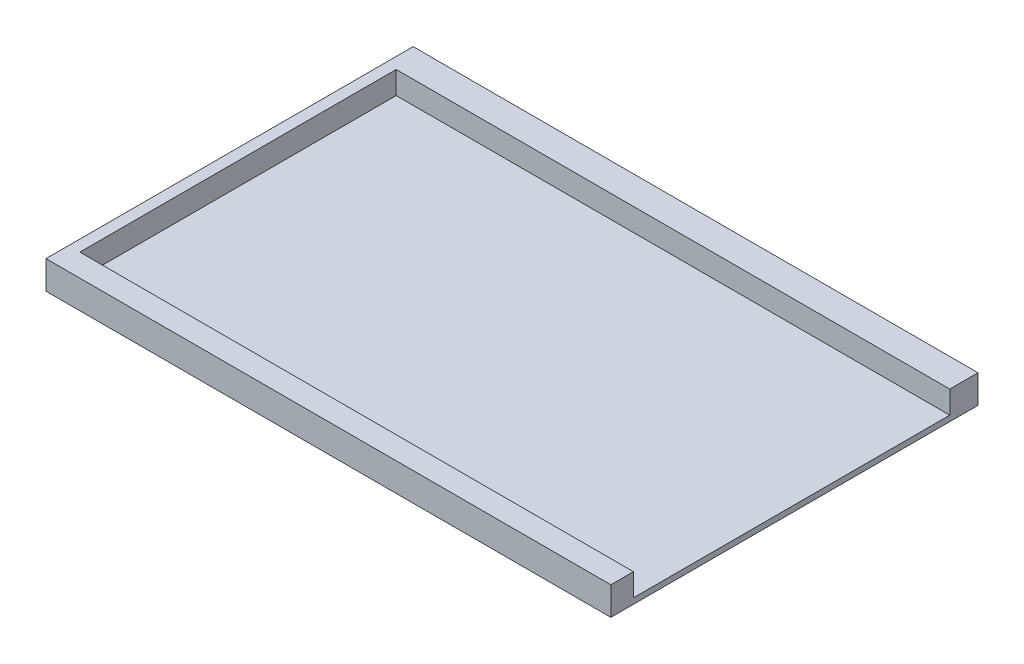
ISO-10303-21;
HEADER;
FILE_DESCRIPTION(('STEP AP214'),'2;1');
FILE_NAME('part.step','',(''),(''),'','','');
FILE_SCHEMA(('AUTOMOTIVE_DESIGN { 1 0 10303 214 1 1 1 1 }'));
ENDSEC;
DATA;
#1=APPLICATION_CONTEXT('core data for automotive mechanical design processes');
#2=APPLICATION_PROTOCOL_DEFINITION('international standard','automotive_design',2000,#1);
#3=PRODUCT_CONTEXT('',#1,'mechanical');
#4=PRODUCT('Part','Part','',(#3));
#5=PRODUCT_RELATED_PRODUCT_CATEGORY('part','',(#4));
#6=PRODUCT_DEFINITION_FORMATION('','',#4);
#7=PRODUCT_DEFINITION_CONTEXT('part definition',#1,'design');
#8=PRODUCT_DEFINITION('design','',#6,#7);
#9=PRODUCT_DEFINITION_SHAPE('','',#8);
#10=(LENGTH_UNIT() NAMED_UNIT(*) SI_UNIT(.MILLI.,.METRE.));
#11=(NAMED_UNIT(*) PLANE_ANGLE_UNIT() SI_UNIT($,.RADIAN.));
#12=(NAMED_UNIT(*) SI_UNIT($,.STERADIAN.) SOLID_ANGLE_UNIT());
#13=UNCERTAINTY_MEASURE_WITH_UNIT(LENGTH_MEASURE(1.E-05),#10,'distance_accuracy_value','');
#14=(GEOMETRIC_REPRESENTATION_CONTEXT(3) GLOBAL_UNCERTAINTY_ASSIGNED_CONTEXT((#13)) GLOBAL_UNIT_ASSIGNED_CONTEXT((#10,
#11,#12)) REPRESENTATION_CONTEXT('',''));
#15=CARTESIAN_POINT('',(0.,0.,0.));
#16=DIRECTION('',(0.,0.,1.));
#17=DIRECTION('',(1.,0.,0.));
#18=AXIS2_PLACEMENT_3D('',#15,#16,#17);
#19=CARTESIAN_POINT('',(50.,5.,32.5));
#20=DIRECTION('',(-1.,0.,0.));
#21=DIRECTION('',(0.,0.,1.));
#22=AXIS2_PLACEMENT_3D('',#19,#20,#21);
#23=PLANE('',#22);
#24=DIRECTION('',(0.,0.,-1.));
#25=VECTOR('',#24,1.);
#26=CARTESIAN_POINT('',(50.,1.,28.5));
#27=LINE('',#26,#25);
#28=CARTESIAN_POINT('',(50.,1.,28.5));
#29=VERTEX_POINT('',#28);
#30=CARTESIAN_POINT('',(50.,1.,-27.5));
#31=VERTEX_POINT('',#30);
#32=EDGE_CURVE('E140',#29,#31,#27,.T.);
#33=ORIENTED_EDGE('',*,*,#32,.F.);
#34=DIRECTION('',(0.,-1.,0.));
#35=VECTOR('',#34,1.);
#36=CARTESIAN_POINT('',(50.,1.,28.5));
#37=LINE('',#36,#35);
#38=CARTESIAN_POINT('',(50.,5.,28.5));
#39=VERTEX_POINT('',#38);
#40=EDGE_CURVE('E121',#39,#29,#37,.T.);
#41=ORIENTED_EDGE('',*,*,#40,.F.);
#42=DIRECTION('',(0.,0.,-1.));
#43=VECTOR('',#42,1.);
#44=CARTESIAN_POINT('',(50.,5.,32.5));
#45=LINE('',#44,#43);
#46=CARTESIAN_POINT('',(50.,5.,32.5));
#47=VERTEX_POINT('',#46);
#48=EDGE_CURVE('E160',#47,#39,#45,.T.);
#49=ORIENTED_EDGE('',*,*,#48,.F.);
#50=DIRECTION('',(0.,-1.,0.));
#51=VECTOR('',#50,1.);
#52=CARTESIAN_POINT('',(50.,5.,32.5));
#53=LINE('',#52,#51);
#54=CARTESIAN_POINT('',(50.,0.,32.5));
#55=VERTEX_POINT('',#54);
#56=EDGE_CURVE('E171',#47,#55,#53,.T.);
#57=ORIENTED_EDGE('',*,*,#56,.T.);
#58=DIRECTION('',(0.,0.,-1.));
#59=VECTOR('',#58,1.);
#60=CARTESIAN_POINT('',(50.,0.,32.5));
#61=LINE('',#60,#59);
#62=CARTESIAN_POINT('',(50.,0.,-32.5));
#63=VERTEX_POINT('',#62);
#64=EDGE_CURVE('E154',#55,#63,#61,.T.);
#65=ORIENTED_EDGE('',*,*,#64,.T.);
#66=DIRECTION('',(0.,-1.,0.));
#67=VECTOR('',#66,1.);
#68=CARTESIAN_POINT('',(50.,5.,-32.5));
#69=LINE('',#68,#67);
#70=CARTESIAN_POINT('',(50.,5.,-32.5));
#71=VERTEX_POINT('',#70);
#72=EDGE_CURVE('E11',#71,#63,#69,.T.);
#73=ORIENTED_EDGE('',*,*,#72,.F.);
#74=CARTESIAN_POINT('',(50.,5.,-27.5));
#75=VERTEX_POINT('',#74);
#76=EDGE_CURVE('E91',#75,#71,#45,.T.);
#77=ORIENTED_EDGE('',*,*,#76,.F.);
#78=DIRECTION('',(0.,1.,0.));
#79=VECTOR('',#78,1.);
#80=CARTESIAN_POINT('',(50.,1.,-27.5));
#81=LINE('',#80,#79);
#82=EDGE_CURVE('E137',#31,#75,#81,.T.);
#83=ORIENTED_EDGE('',*,*,#82,.F.);
#84=EDGE_LOOP('',(#33,#41,#49,#57,#65,#73,#77,#83));
#85=FACE_BOUND('',#84,.T.);
#86=ADVANCED_FACE('F39',(#85),#23,.F.);
#87=CARTESIAN_POINT('',(-50.,5.,-32.5));
#88=DIRECTION('',(0.,0.,1.));
#89=DIRECTION('',(1.,0.,0.));
#90=AXIS2_PLACEMENT_3D('',#87,#88,#89);
#91=PLANE('',#90);
#92=DIRECTION('',(-1.,0.,0.));
#93=VECTOR('',#92,1.);
#94=CARTESIAN_POINT('',(-50.,0.,-32.5));
#95=LINE('',#94,#93);
#96=CARTESIAN_POINT('',(-50.,0.,-32.5));
#97=VERTEX_POINT('',#96);
#98=EDGE_CURVE('E175',#63,#97,#95,.T.);
#99=ORIENTED_EDGE('',*,*,#98,.T.);
#100=DIRECTION('',(0.,-1.,0.));
#101=VECTOR('',#100,1.);
#102=CARTESIAN_POINT('',(-50.,5.,-32.5));
#103=LINE('',#102,#101);
#104=CARTESIAN_POINT('',(-50.,5.,-32.5));
#105=VERTEX_POINT('',#104);
#106=EDGE_CURVE('E47',#105,#97,#103,.T.);
#107=ORIENTED_EDGE('',*,*,#106,.F.);
#108=DIRECTION('',(-1.,0.,0.));
#109=VECTOR('',#108,1.);
#110=CARTESIAN_POINT('',(-50.,5.,-32.5));
#111=LINE('',#110,#109);
#112=EDGE_CURVE('E163',#71,#105,#111,.T.);
#113=ORIENTED_EDGE('',*,*,#112,.F.);
#114=ORIENTED_EDGE('',*,*,#72,.T.);
#115=EDGE_LOOP('',(#99,#107,#113,#114));
#116=FACE_BOUND('',#115,.T.);
#117=ADVANCED_FACE('F211',(#116),#91,.F.);
#118=CARTESIAN_POINT('',(-50.,5.,32.5));
#119=DIRECTION('',(1.,0.,0.));
#120=DIRECTION('',(0.,0.,-1.));
#121=AXIS2_PLACEMENT_3D('',#118,#119,#120);
#122=PLANE('',#121);
#123=DIRECTION('',(0.,0.,1.));
#124=VECTOR('',#123,1.);
#125=CARTESIAN_POINT('',(-50.,0.,32.5));
#126=LINE('',#125,#124);
#127=CARTESIAN_POINT('',(-50.,0.,32.5));
#128=VERTEX_POINT('',#127);
#129=EDGE_CURVE('E178',#97,#128,#126,.T.);
#130=ORIENTED_EDGE('',*,*,#129,.T.);
#131=DIRECTION('',(0.,-1.,0.));
#132=VECTOR('',#131,1.);
#133=CARTESIAN_POINT('',(-50.,5.,32.5));
#134=LINE('',#133,#132);
#135=CARTESIAN_POINT('',(-50.,5.,32.5));
#136=VERTEX_POINT('',#135);
#137=EDGE_CURVE('E185',#136,#128,#134,.T.);
#138=ORIENTED_EDGE('',*,*,#137,.F.);
#139=DIRECTION('',(0.,0.,1.));
#140=VECTOR('',#139,1.);
#141=CARTESIAN_POINT('',(-50.,5.,32.5));
#142=LINE('',#141,#140);
#143=EDGE_CURVE('E166',#105,#136,#142,.T.);
#144=ORIENTED_EDGE('',*,*,#143,.F.);
#145=ORIENTED_EDGE('',*,*,#106,.T.);
#146=EDGE_LOOP('',(#130,#138,#144,#145));
#147=FACE_BOUND('',#146,.T.);
#148=ADVANCED_FACE('F193',(#147),#122,.F.);
#149=CARTESIAN_POINT('',(-50.,5.,32.5));
#150=DIRECTION('',(0.,0.,-1.));
#151=DIRECTION('',(-1.,0.,0.));
#152=AXIS2_PLACEMENT_3D('',#149,#150,#151);
#153=PLANE('',#152);
#154=DIRECTION('',(1.,0.,0.));
#155=VECTOR('',#154,1.);
#156=CARTESIAN_POINT('',(-50.,0.,32.5));
#157=LINE('',#156,#155);
#158=EDGE_CURVE('E84',#128,#55,#157,.T.);
#159=ORIENTED_EDGE('',*,*,#158,.T.);
#160=ORIENTED_EDGE('',*,*,#56,.F.);
#161=DIRECTION('',(1.,0.,0.));
#162=VECTOR('',#161,1.);
#163=CARTESIAN_POINT('',(-50.,5.,32.5));
#164=LINE('',#163,#162);
#165=EDGE_CURVE('E63',#136,#47,#164,.T.);
#166=ORIENTED_EDGE('',*,*,#165,.F.);
#167=ORIENTED_EDGE('',*,*,#137,.T.);
#168=EDGE_LOOP('',(#159,#160,#166,#167));
#169=FACE_BOUND('',#168,.T.);
#170=ADVANCED_FACE('F202',(#169),#153,.F.);
#171=CARTESIAN_POINT('',(0.,5.,0.));
#172=DIRECTION('',(0.,-1.,0.));
#173=DIRECTION('',(0.,0.,-1.));
#174=AXIS2_PLACEMENT_3D('',#171,#172,#173);
#175=PLANE('',#174);
#176=ORIENTED_EDGE('',*,*,#48,.T.);
#177=DIRECTION('',(1.,0.,0.));
#178=VECTOR('',#177,1.);
#179=CARTESIAN_POINT('',(-48.,5.,28.5));
#180=LINE('',#179,#178);
#181=CARTESIAN_POINT('',(-48.,5.,28.5));
#182=VERTEX_POINT('',#181);
#183=EDGE_CURVE('E151',#182,#39,#180,.T.);
#184=ORIENTED_EDGE('',*,*,#183,.F.);
#185=DIRECTION('',(0.,0.,1.));
#186=VECTOR('',#185,1.);
#187=CARTESIAN_POINT('',(-48.,5.,28.5));
#188=LINE('',#187,#186);
#189=CARTESIAN_POINT('',(-48.,5.,-27.5));
#190=VERTEX_POINT('',#189);
#191=EDGE_CURVE('E127',#190,#182,#188,.T.);
#192=ORIENTED_EDGE('',*,*,#191,.F.);
#193=DIRECTION('',(1.,0.,0.));
#194=VECTOR('',#193,1.);
#195=CARTESIAN_POINT('',(-48.,5.,-27.5));
#196=LINE('',#195,#194);
#197=EDGE_CURVE('E155',#190,#75,#196,.T.);
#198=ORIENTED_EDGE('',*,*,#197,.T.);
#199=ORIENTED_EDGE('',*,*,#76,.T.);
#200=ORIENTED_EDGE('',*,*,#112,.T.);
#201=ORIENTED_EDGE('',*,*,#143,.T.);
#202=ORIENTED_EDGE('',*,*,#165,.T.);
#203=EDGE_LOOP('',(#176,#184,#192,#198,#199,#200,#201,#202));
#204=FACE_BOUND('',#203,.T.);
#205=ADVANCED_FACE('F204',(#204),#175,.F.);
#206=CARTESIAN_POINT('',(0.,0.,0.));
#207=DIRECTION('',(0.,-1.,0.));
#208=DIRECTION('',(0.,0.,-1.));
#209=AXIS2_PLACEMENT_3D('',#206,#207,#208);
#210=PLANE('',#209);
#211=ORIENTED_EDGE('',*,*,#64,.F.);
#212=ORIENTED_EDGE('',*,*,#158,.F.);
#213=ORIENTED_EDGE('',*,*,#129,.F.);
#214=ORIENTED_EDGE('',*,*,#98,.F.);
#215=EDGE_LOOP('',(#211,#212,#213,#214));
#216=FACE_BOUND('',#215,.T.);
#217=ADVANCED_FACE('F198',(#216),#210,.T.);
#218=CARTESIAN_POINT('',(-48.,1.,28.5));
#219=DIRECTION('',(0.,0.,1.));
#220=DIRECTION('',(1.,0.,0.));
#221=AXIS2_PLACEMENT_3D('',#218,#219,#220);
#222=PLANE('',#221);
#223=ORIENTED_EDGE('',*,*,#40,.T.);
#224=DIRECTION('',(1.,0.,0.));
#225=VECTOR('',#224,1.);
#226=CARTESIAN_POINT('',(-48.,1.,28.5));
#227=LINE('',#226,#225);
#228=CARTESIAN_POINT('',(-48.,1.,28.5));
#229=VERTEX_POINT('',#228);
#230=EDGE_CURVE('E115',#229,#29,#227,.T.);
#231=ORIENTED_EDGE('',*,*,#230,.F.);
#232=DIRECTION('',(0.,-1.,0.));
#233=VECTOR('',#232,1.);
#234=CARTESIAN_POINT('',(-48.,1.,28.5));
#235=LINE('',#234,#233);
#236=EDGE_CURVE('E119',#182,#229,#235,.T.);
#237=ORIENTED_EDGE('',*,*,#236,.F.);
#238=ORIENTED_EDGE('',*,*,#183,.T.);
#239=EDGE_LOOP('',(#223,#231,#237,#238));
#240=FACE_BOUND('',#239,.T.);
#241=ADVANCED_FACE('F117',(#240),#222,.F.);
#242=CARTESIAN_POINT('',(-48.,1.,-27.5));
#243=DIRECTION('',(0.,0.,-1.));
#244=DIRECTION('',(0.,1.,0.));
#245=AXIS2_PLACEMENT_3D('',#242,#243,#244);
#246=PLANE('',#245);
#247=ORIENTED_EDGE('',*,*,#82,.T.);
#248=ORIENTED_EDGE('',*,*,#197,.F.);
#249=DIRECTION('',(0.,1.,0.));
#250=VECTOR('',#249,1.);
#251=CARTESIAN_POINT('',(-48.,1.,-27.5));
#252=LINE('',#251,#250);
#253=CARTESIAN_POINT('',(-48.,1.,-27.5));
#254=VERTEX_POINT('',#253);
#255=EDGE_CURVE('E54',#254,#190,#252,.T.);
#256=ORIENTED_EDGE('',*,*,#255,.F.);
#257=DIRECTION('',(1.,0.,0.));
#258=VECTOR('',#257,1.);
#259=CARTESIAN_POINT('',(-48.,1.,-27.5));
#260=LINE('',#259,#258);
#261=EDGE_CURVE('E126',#254,#31,#260,.T.);
#262=ORIENTED_EDGE('',*,*,#261,.T.);
#263=EDGE_LOOP('',(#247,#248,#256,#262));
#264=FACE_BOUND('',#263,.T.);
#265=ADVANCED_FACE('F222',(#264),#246,.F.);
#266=CARTESIAN_POINT('',(-48.,1.,28.5));
#267=DIRECTION('',(0.,-1.,0.));
#268=DIRECTION('',(0.,0.,-1.));
#269=AXIS2_PLACEMENT_3D('',#266,#267,#268);
#270=PLANE('',#269);
#271=ORIENTED_EDGE('',*,*,#32,.T.);
#272=ORIENTED_EDGE('',*,*,#261,.F.);
#273=DIRECTION('',(0.,0.,-1.));
#274=VECTOR('',#273,1.);
#275=CARTESIAN_POINT('',(-48.,1.,28.5));
#276=LINE('',#275,#274);
#277=EDGE_CURVE('E129',#229,#254,#276,.T.);
#278=ORIENTED_EDGE('',*,*,#277,.F.);
#279=ORIENTED_EDGE('',*,*,#230,.T.);
#280=EDGE_LOOP('',(#271,#272,#278,#279));
#281=FACE_BOUND('',#280,.T.);
#282=ADVANCED_FACE('F130',(#281),#270,.F.);
#283=CARTESIAN_POINT('',(-48.,0.,0.));
#284=DIRECTION('',(-1.,0.,0.));
#285=DIRECTION('',(0.,0.,1.));
#286=AXIS2_PLACEMENT_3D('',#283,#284,#285);
#287=PLANE('',#286);
#288=ORIENTED_EDGE('',*,*,#236,.T.);
#289=ORIENTED_EDGE('',*,*,#277,.T.);
#290=ORIENTED_EDGE('',*,*,#255,.T.);
#291=ORIENTED_EDGE('',*,*,#191,.T.);
#292=EDGE_LOOP('',(#288,#289,#290,#291));
#293=FACE_BOUND('',#292,.T.);
#294=ADVANCED_FACE('F133',(#293),#287,.F.);
#295=CLOSED_SHELL('',(#86,#117,#148,#170,#205,#217,#241,#265,#282,#294));
#296=MANIFOLD_SOLID_BREP('B2',#295);
#297=ADVANCED_BREP_SHAPE_REPRESENTATION('',(#18,#296),#14);
#298=SHAPE_DEFINITION_REPRESENTATION(#9,#297);
ENDSEC;
END-ISO-10303-21;
